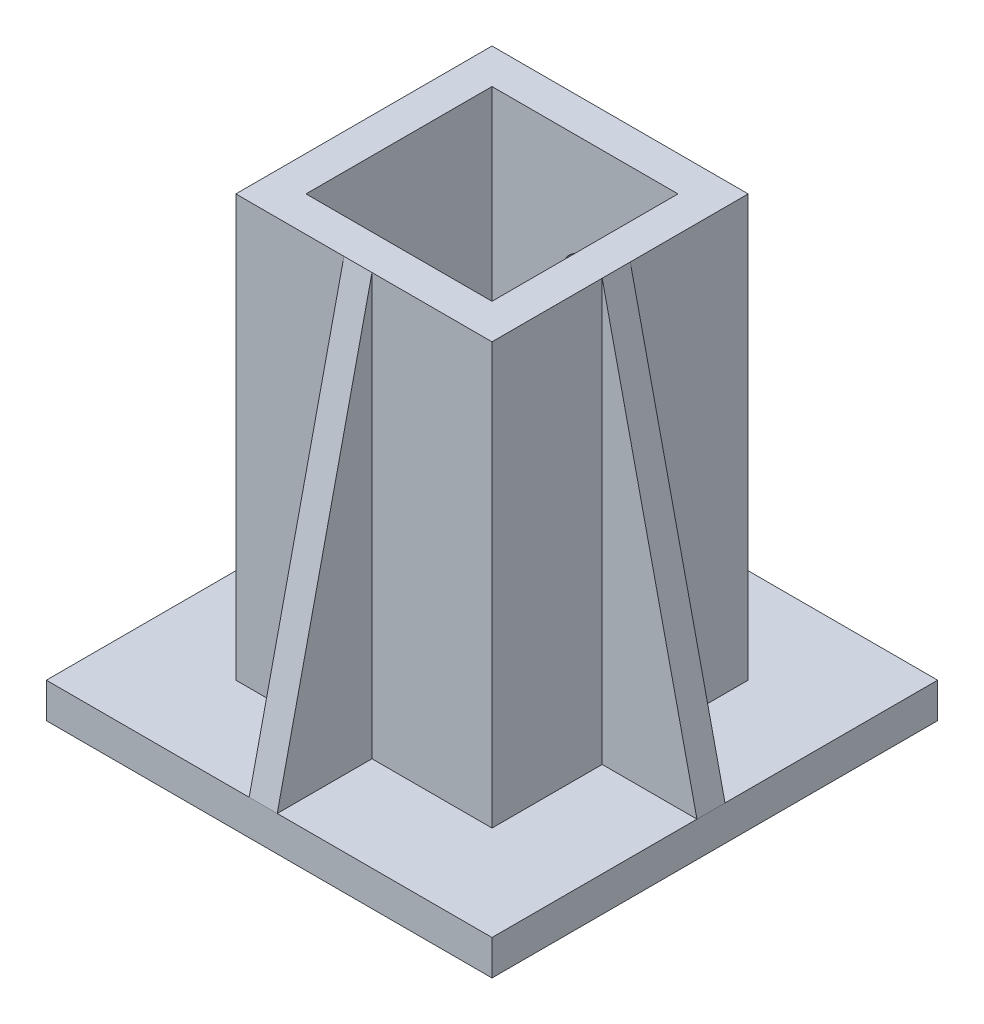
ISO-10303-21;
HEADER;
FILE_DESCRIPTION(('STEP AP214'),'2;1');
FILE_NAME('part.step','',(''),(''),'','','');
FILE_SCHEMA(('AUTOMOTIVE_DESIGN { 1 0 10303 214 1 1 1 1 }'));
ENDSEC;
DATA;
#1=APPLICATION_CONTEXT('core data for automotive mechanical design processes');
#2=APPLICATION_PROTOCOL_DEFINITION('international standard','automotive_design',2000,#1);
#3=PRODUCT_CONTEXT('',#1,'mechanical');
#4=PRODUCT('Part','Part','',(#3));
#5=PRODUCT_RELATED_PRODUCT_CATEGORY('part','',(#4));
#6=PRODUCT_DEFINITION_FORMATION('','',#4);
#7=PRODUCT_DEFINITION_CONTEXT('part definition',#1,'design');
#8=PRODUCT_DEFINITION('design','',#6,#7);
#9=PRODUCT_DEFINITION_SHAPE('','',#8);
#10=(LENGTH_UNIT() NAMED_UNIT(*) SI_UNIT(.MILLI.,.METRE.));
#11=(NAMED_UNIT(*) PLANE_ANGLE_UNIT() SI_UNIT($,.RADIAN.));
#12=(NAMED_UNIT(*) SI_UNIT($,.STERADIAN.) SOLID_ANGLE_UNIT());
#13=UNCERTAINTY_MEASURE_WITH_UNIT(LENGTH_MEASURE(1.E-05),#10,'distance_accuracy_value','');
#14=(GEOMETRIC_REPRESENTATION_CONTEXT(3) GLOBAL_UNCERTAINTY_ASSIGNED_CONTEXT((#13)) GLOBAL_UNIT_ASSIGNED_CONTEXT((#10,
#11,#12)) REPRESENTATION_CONTEXT('',''));
#15=CARTESIAN_POINT('',(0.,0.,0.));
#16=DIRECTION('',(0.,0.,1.));
#17=DIRECTION('',(1.,0.,0.));
#18=AXIS2_PLACEMENT_3D('',#15,#16,#17);
#19=CARTESIAN_POINT('',(0.,5.,0.));
#20=DIRECTION('',(0.,-1.,0.));
#21=DIRECTION('',(0.,0.,-1.));
#22=AXIS2_PLACEMENT_3D('',#19,#20,#21);
#23=PLANE('',#22);
#24=DIRECTION('',(0.,0.,1.));
#25=VECTOR('',#24,1.);
#26=CARTESIAN_POINT('',(-2.85000000000001,5.,18.25));
#27=LINE('',#26,#25);
#28=CARTESIAN_POINT('',(-2.85000000000001,5.,18.25));
#29=VERTEX_POINT('',#28);
#30=CARTESIAN_POINT('',(-2.85000000000005,5.,31.75));
#31=VERTEX_POINT('',#30);
#32=EDGE_CURVE('E195',#29,#31,#27,.T.);
#33=ORIENTED_EDGE('',*,*,#32,.F.);
#34=DIRECTION('',(1.,0.,0.));
#35=VECTOR('',#34,1.);
#36=CARTESIAN_POINT('',(18.25,5.,18.25));
#37=LINE('',#36,#35);
#38=CARTESIAN_POINT('',(-18.25,5.,18.25));
#39=VERTEX_POINT('',#38);
#40=EDGE_CURVE('E205',#39,#29,#37,.T.);
#41=ORIENTED_EDGE('',*,*,#40,.F.);
#42=DIRECTION('',(0.,0.,1.));
#43=VECTOR('',#42,1.);
#44=CARTESIAN_POINT('',(-18.25,5.,18.25));
#45=LINE('',#44,#43);
#46=CARTESIAN_POINT('',(-18.25,5.,2.55));
#47=VERTEX_POINT('',#46);
#48=EDGE_CURVE('E230',#47,#39,#45,.T.);
#49=ORIENTED_EDGE('',*,*,#48,.F.);
#50=DIRECTION('',(1.,0.,0.));
#51=VECTOR('',#50,1.);
#52=CARTESIAN_POINT('',(-31.75,5.,2.55));
#53=LINE('',#52,#51);
#54=CARTESIAN_POINT('',(-31.75,5.,2.55));
#55=VERTEX_POINT('',#54);
#56=EDGE_CURVE('E323',#55,#47,#53,.T.);
#57=ORIENTED_EDGE('',*,*,#56,.F.);
#58=DIRECTION('',(0.,0.,1.));
#59=VECTOR('',#58,1.);
#60=CARTESIAN_POINT('',(-31.75,5.,-31.75));
#61=LINE('',#60,#59);
#62=CARTESIAN_POINT('',(-31.75,5.,31.75));
#63=VERTEX_POINT('',#62);
#64=EDGE_CURVE('E248',#55,#63,#61,.T.);
#65=ORIENTED_EDGE('',*,*,#64,.T.);
#66=DIRECTION('',(1.,0.,0.));
#67=VECTOR('',#66,1.);
#68=CARTESIAN_POINT('',(31.75,5.,31.75));
#69=LINE('',#68,#67);
#70=EDGE_CURVE('E249',#63,#31,#69,.T.);
#71=ORIENTED_EDGE('',*,*,#70,.T.);
#72=EDGE_LOOP('',(#33,#41,#49,#57,#65,#71));
#73=FACE_BOUND('',#72,.T.);
#74=ADVANCED_FACE('F33',(#73),#23,.F.);
#75=DIRECTION('',(0.,0.,-1.));
#76=VECTOR('',#75,1.);
#77=CARTESIAN_POINT('',(1.14999999999999,5.,18.25));
#78=LINE('',#77,#76);
#79=CARTESIAN_POINT('',(1.15,5.,31.75));
#80=VERTEX_POINT('',#79);
#81=CARTESIAN_POINT('',(1.14999999999999,5.,18.25));
#82=VERTEX_POINT('',#81);
#83=EDGE_CURVE('E207',#80,#82,#78,.T.);
#84=ORIENTED_EDGE('',*,*,#83,.F.);
#85=CARTESIAN_POINT('',(31.75,5.,31.75));
#86=VERTEX_POINT('',#85);
#87=EDGE_CURVE('E247',#80,#86,#69,.T.);
#88=ORIENTED_EDGE('',*,*,#87,.T.);
#89=DIRECTION('',(0.,0.,-1.));
#90=VECTOR('',#89,1.);
#91=CARTESIAN_POINT('',(31.75,5.,-31.75));
#92=LINE('',#91,#90);
#93=CARTESIAN_POINT('',(31.75,5.,2.55000000000005));
#94=VERTEX_POINT('',#93);
#95=EDGE_CURVE('E252',#86,#94,#92,.T.);
#96=ORIENTED_EDGE('',*,*,#95,.T.);
#97=DIRECTION('',(1.,0.,0.));
#98=VECTOR('',#97,1.);
#99=CARTESIAN_POINT('',(18.25,5.,2.55));
#100=LINE('',#99,#98);
#101=CARTESIAN_POINT('',(18.25,5.,2.55));
#102=VERTEX_POINT('',#101);
#103=EDGE_CURVE('E307',#102,#94,#100,.T.);
#104=ORIENTED_EDGE('',*,*,#103,.F.);
#105=DIRECTION('',(0.,0.,-1.));
#106=VECTOR('',#105,1.);
#107=CARTESIAN_POINT('',(18.25,5.,18.25));
#108=LINE('',#107,#106);
#109=CARTESIAN_POINT('',(18.25,5.,18.25));
#110=VERTEX_POINT('',#109);
#111=EDGE_CURVE('E224',#110,#102,#108,.T.);
#112=ORIENTED_EDGE('',*,*,#111,.F.);
#113=EDGE_CURVE('E234',#82,#110,#37,.T.);
#114=ORIENTED_EDGE('',*,*,#113,.F.);
#115=EDGE_LOOP('',(#84,#88,#96,#104,#112,#114));
#116=FACE_BOUND('',#115,.T.);
#117=ADVANCED_FACE('F404',(#116),#23,.F.);
#118=CARTESIAN_POINT('',(18.25,65.,18.25));
#119=DIRECTION('',(0.,0.,-1.));
#120=DIRECTION('',(-1.,0.,0.));
#121=AXIS2_PLACEMENT_3D('',#118,#119,#120);
#122=PLANE('',#121);
#123=DIRECTION('',(0.,-1.,0.));
#124=VECTOR('',#123,1.);
#125=CARTESIAN_POINT('',(-2.85000000000001,65.,18.25));
#126=LINE('',#125,#124);
#127=CARTESIAN_POINT('',(-2.85000000000005,65.,18.25));
#128=VERTEX_POINT('',#127);
#129=EDGE_CURVE('E193',#128,#29,#126,.T.);
#130=ORIENTED_EDGE('',*,*,#129,.F.);
#131=DIRECTION('',(1.,0.,0.));
#132=VECTOR('',#131,1.);
#133=CARTESIAN_POINT('',(18.25,65.,18.25));
#134=LINE('',#133,#132);
#135=CARTESIAN_POINT('',(-18.25,65.,18.25));
#136=VERTEX_POINT('',#135);
#137=EDGE_CURVE('E203',#136,#128,#134,.T.);
#138=ORIENTED_EDGE('',*,*,#137,.F.);
#139=DIRECTION('',(0.,-1.,0.));
#140=VECTOR('',#139,1.);
#141=CARTESIAN_POINT('',(-18.25,65.,18.25));
#142=LINE('',#141,#140);
#143=EDGE_CURVE('E218',#136,#39,#142,.T.);
#144=ORIENTED_EDGE('',*,*,#143,.T.);
#145=ORIENTED_EDGE('',*,*,#40,.T.);
#146=EDGE_LOOP('',(#130,#138,#144,#145));
#147=FACE_BOUND('',#146,.T.);
#148=ADVANCED_FACE('F201',(#147),#122,.F.);
#149=DIRECTION('',(0.,-1.,0.));
#150=VECTOR('',#149,1.);
#151=CARTESIAN_POINT('',(1.14999999999999,65.,18.25));
#152=LINE('',#151,#150);
#153=CARTESIAN_POINT('',(1.14999999999993,65.,18.25));
#154=VERTEX_POINT('',#153);
#155=EDGE_CURVE('E206',#154,#82,#152,.T.);
#156=ORIENTED_EDGE('',*,*,#155,.T.);
#157=ORIENTED_EDGE('',*,*,#113,.T.);
#158=DIRECTION('',(0.,-1.,0.));
#159=VECTOR('',#158,1.);
#160=CARTESIAN_POINT('',(18.25,65.,18.25));
#161=LINE('',#160,#159);
#162=CARTESIAN_POINT('',(18.25,65.,18.25));
#163=VERTEX_POINT('',#162);
#164=EDGE_CURVE('E214',#163,#110,#161,.T.);
#165=ORIENTED_EDGE('',*,*,#164,.F.);
#166=EDGE_CURVE('E215',#154,#163,#134,.T.);
#167=ORIENTED_EDGE('',*,*,#166,.F.);
#168=EDGE_LOOP('',(#156,#157,#165,#167));
#169=FACE_BOUND('',#168,.T.);
#170=ADVANCED_FACE('F428',(#169),#122,.F.);
#171=DIRECTION('',(-1.,0.,0.));
#172=VECTOR('',#171,1.);
#173=CARTESIAN_POINT('',(18.25,5.,-1.45));
#174=LINE('',#173,#172);
#175=CARTESIAN_POINT('',(31.75,5.,-1.45));
#176=VERTEX_POINT('',#175);
#177=CARTESIAN_POINT('',(18.25,5.,-1.45));
#178=VERTEX_POINT('',#177);
#179=EDGE_CURVE('E310',#176,#178,#174,.T.);
#180=ORIENTED_EDGE('',*,*,#179,.F.);
#181=CARTESIAN_POINT('',(31.75,5.,-31.75));
#182=VERTEX_POINT('',#181);
#183=EDGE_CURVE('E251',#176,#182,#92,.T.);
#184=ORIENTED_EDGE('',*,*,#183,.T.);
#185=DIRECTION('',(-1.,0.,0.));
#186=VECTOR('',#185,1.);
#187=CARTESIAN_POINT('',(31.75,5.,-31.75));
#188=LINE('',#187,#186);
#189=CARTESIAN_POINT('',(-31.75,5.,-31.75));
#190=VERTEX_POINT('',#189);
#191=EDGE_CURVE('E255',#182,#190,#188,.T.);
#192=ORIENTED_EDGE('',*,*,#191,.T.);
#193=CARTESIAN_POINT('',(-31.75,5.,-1.44999999999995));
#194=VERTEX_POINT('',#193);
#195=EDGE_CURVE('E245',#190,#194,#61,.T.);
#196=ORIENTED_EDGE('',*,*,#195,.T.);
#197=DIRECTION('',(-1.,0.,0.));
#198=VECTOR('',#197,1.);
#199=CARTESIAN_POINT('',(-31.75,5.,-1.45));
#200=LINE('',#199,#198);
#201=CARTESIAN_POINT('',(-18.25,5.,-1.45));
#202=VERTEX_POINT('',#201);
#203=EDGE_CURVE('E325',#202,#194,#200,.T.);
#204=ORIENTED_EDGE('',*,*,#203,.F.);
#205=CARTESIAN_POINT('',(-18.25,5.,-18.25));
#206=VERTEX_POINT('',#205);
#207=EDGE_CURVE('E231',#206,#202,#45,.T.);
#208=ORIENTED_EDGE('',*,*,#207,.F.);
#209=DIRECTION('',(-1.,0.,0.));
#210=VECTOR('',#209,1.);
#211=CARTESIAN_POINT('',(18.25,5.,-18.25));
#212=LINE('',#211,#210);
#213=CARTESIAN_POINT('',(18.25,5.,-18.25));
#214=VERTEX_POINT('',#213);
#215=EDGE_CURVE('E227',#214,#206,#212,.T.);
#216=ORIENTED_EDGE('',*,*,#215,.F.);
#217=EDGE_CURVE('E58',#178,#214,#108,.T.);
#218=ORIENTED_EDGE('',*,*,#217,.F.);
#219=EDGE_LOOP('',(#180,#184,#192,#196,#204,#208,#216,#218));
#220=FACE_BOUND('',#219,.T.);
#221=ADVANCED_FACE('F411',(#220),#23,.F.);
#222=CARTESIAN_POINT('',(18.25,65.,18.25));
#223=DIRECTION('',(-1.,0.,0.));
#224=DIRECTION('',(0.,0.,1.));
#225=AXIS2_PLACEMENT_3D('',#222,#223,#224);
#226=PLANE('',#225);
#227=DIRECTION('',(0.,-1.,0.));
#228=VECTOR('',#227,1.);
#229=CARTESIAN_POINT('',(18.25,65.,2.55));
#230=LINE('',#229,#228);
#231=CARTESIAN_POINT('',(18.25,65.,2.55000000000005));
#232=VERTEX_POINT('',#231);
#233=EDGE_CURVE('E314',#232,#102,#230,.T.);
#234=ORIENTED_EDGE('',*,*,#233,.F.);
#235=DIRECTION('',(0.,0.,-1.));
#236=VECTOR('',#235,1.);
#237=CARTESIAN_POINT('',(18.25,65.,18.25));
#238=LINE('',#237,#236);
#239=EDGE_CURVE('E363',#163,#232,#238,.T.);
#240=ORIENTED_EDGE('',*,*,#239,.F.);
#241=ORIENTED_EDGE('',*,*,#164,.T.);
#242=ORIENTED_EDGE('',*,*,#111,.T.);
#243=EDGE_LOOP('',(#234,#240,#241,#242));
#244=FACE_BOUND('',#243,.T.);
#245=ADVANCED_FACE('F427',(#244),#226,.F.);
#246=DIRECTION('',(0.,-1.,0.));
#247=VECTOR('',#246,1.);
#248=CARTESIAN_POINT('',(18.25,65.,-1.45));
#249=LINE('',#248,#247);
#250=CARTESIAN_POINT('',(18.25,65.,-1.44999999999995));
#251=VERTEX_POINT('',#250);
#252=EDGE_CURVE('E312',#251,#178,#249,.T.);
#253=ORIENTED_EDGE('',*,*,#252,.T.);
#254=ORIENTED_EDGE('',*,*,#217,.T.);
#255=DIRECTION('',(0.,-1.,0.));
#256=VECTOR('',#255,1.);
#257=CARTESIAN_POINT('',(18.25,65.,-18.25));
#258=LINE('',#257,#256);
#259=CARTESIAN_POINT('',(18.25,65.,-18.25));
#260=VERTEX_POINT('',#259);
#261=EDGE_CURVE('E241',#260,#214,#258,.T.);
#262=ORIENTED_EDGE('',*,*,#261,.F.);
#263=EDGE_CURVE('E235',#251,#260,#238,.T.);
#264=ORIENTED_EDGE('',*,*,#263,.F.);
#265=EDGE_LOOP('',(#253,#254,#262,#264));
#266=FACE_BOUND('',#265,.T.);
#267=ADVANCED_FACE('F434',(#266),#226,.F.);
#268=CARTESIAN_POINT('',(-31.75,5.,-31.75));
#269=DIRECTION('',(1.,0.,0.));
#270=DIRECTION('',(0.,0.,-1.));
#271=AXIS2_PLACEMENT_3D('',#268,#269,#270);
#272=PLANE('',#271);
#273=DIRECTION('',(0.,0.,-1.));
#274=VECTOR('',#273,1.);
#275=CARTESIAN_POINT('',(-31.75,5.,141.122521626764));
#276=LINE('',#275,#274);
#277=EDGE_CURVE('E316',#55,#194,#276,.T.);
#278=ORIENTED_EDGE('',*,*,#277,.T.);
#279=ORIENTED_EDGE('',*,*,#195,.F.);
#280=DIRECTION('',(0.,-1.,0.));
#281=VECTOR('',#280,1.);
#282=CARTESIAN_POINT('',(-31.75,5.,-31.75));
#283=LINE('',#282,#281);
#284=CARTESIAN_POINT('',(-31.75,0.,-31.75));
#285=VERTEX_POINT('',#284);
#286=EDGE_CURVE('E257',#190,#285,#283,.T.);
#287=ORIENTED_EDGE('',*,*,#286,.T.);
#288=DIRECTION('',(0.,0.,1.));
#289=VECTOR('',#288,1.);
#290=CARTESIAN_POINT('',(-31.75,0.,-31.75));
#291=LINE('',#290,#289);
#292=CARTESIAN_POINT('',(-31.75,0.,31.75));
#293=VERTEX_POINT('',#292);
#294=EDGE_CURVE('E244',#285,#293,#291,.T.);
#295=ORIENTED_EDGE('',*,*,#294,.T.);
#296=DIRECTION('',(0.,-1.,0.));
#297=VECTOR('',#296,1.);
#298=CARTESIAN_POINT('',(-31.75,5.,31.75));
#299=LINE('',#298,#297);
#300=EDGE_CURVE('E274',#63,#293,#299,.T.);
#301=ORIENTED_EDGE('',*,*,#300,.F.);
#302=ORIENTED_EDGE('',*,*,#64,.F.);
#303=EDGE_LOOP('',(#278,#279,#287,#295,#301,#302));
#304=FACE_BOUND('',#303,.T.);
#305=ADVANCED_FACE('F35',(#304),#272,.F.);
#306=CARTESIAN_POINT('',(0.,65.,0.));
#307=DIRECTION('',(0.,1.,0.));
#308=DIRECTION('',(0.,0.,1.));
#309=AXIS2_PLACEMENT_3D('',#306,#307,#308);
#310=PLANE('',#309);
#311=DIRECTION('',(1.,0.,0.));
#312=VECTOR('',#311,1.);
#313=CARTESIAN_POINT('',(-141.422521626764,65.,18.25));
#314=LINE('',#313,#312);
#315=EDGE_CURVE('E180',#128,#154,#314,.T.);
#316=ORIENTED_EDGE('',*,*,#315,.T.);
#317=ORIENTED_EDGE('',*,*,#166,.T.);
#318=ORIENTED_EDGE('',*,*,#239,.T.);
#319=DIRECTION('',(0.,0.,-1.));
#320=VECTOR('',#319,1.);
#321=CARTESIAN_POINT('',(18.25,65.,141.122521626764));
#322=LINE('',#321,#320);
#323=EDGE_CURVE('E300',#232,#251,#322,.T.);
#324=ORIENTED_EDGE('',*,*,#323,.T.);
#325=ORIENTED_EDGE('',*,*,#263,.T.);
#326=DIRECTION('',(-1.,0.,0.));
#327=VECTOR('',#326,1.);
#328=CARTESIAN_POINT('',(18.25,65.,-18.25));
#329=LINE('',#328,#327);
#330=CARTESIAN_POINT('',(-18.25,65.,-18.25));
#331=VERTEX_POINT('',#330);
#332=EDGE_CURVE('E365',#260,#331,#329,.T.);
#333=ORIENTED_EDGE('',*,*,#332,.T.);
#334=DIRECTION('',(0.,0.,1.));
#335=VECTOR('',#334,1.);
#336=CARTESIAN_POINT('',(-18.25,65.,18.25));
#337=LINE('',#336,#335);
#338=CARTESIAN_POINT('',(-18.25,65.,-1.45));
#339=VERTEX_POINT('',#338);
#340=EDGE_CURVE('E220',#331,#339,#337,.T.);
#341=ORIENTED_EDGE('',*,*,#340,.T.);
#342=DIRECTION('',(0.,0.,-1.));
#343=VECTOR('',#342,1.);
#344=CARTESIAN_POINT('',(-18.25,65.,141.122521626764));
#345=LINE('',#344,#343);
#346=CARTESIAN_POINT('',(-18.25,65.,2.55));
#347=VERTEX_POINT('',#346);
#348=EDGE_CURVE('E50',#347,#339,#345,.T.);
#349=ORIENTED_EDGE('',*,*,#348,.F.);
#350=EDGE_CURVE('E212',#347,#136,#337,.T.);
#351=ORIENTED_EDGE('',*,*,#350,.T.);
#352=ORIENTED_EDGE('',*,*,#137,.T.);
#353=EDGE_LOOP('',(#316,#317,#318,#324,#325,#333,#341,#349,#351,#352));
#354=FACE_BOUND('',#353,.T.);
#355=DIRECTION('',(1.,0.,0.));
#356=VECTOR('',#355,1.);
#357=CARTESIAN_POINT('',(13.25,65.,13.25));
#358=LINE('',#357,#356);
#359=CARTESIAN_POINT('',(-13.25,65.,13.25));
#360=VERTEX_POINT('',#359);
#361=CARTESIAN_POINT('',(13.25,65.,13.25));
#362=VERTEX_POINT('',#361);
#363=EDGE_CURVE('E336',#360,#362,#358,.T.);
#364=ORIENTED_EDGE('',*,*,#363,.F.);
#365=DIRECTION('',(0.,0.,1.));
#366=VECTOR('',#365,1.);
#367=CARTESIAN_POINT('',(-13.25,65.,13.25));
#368=LINE('',#367,#366);
#369=CARTESIAN_POINT('',(-13.25,65.,-13.25));
#370=VERTEX_POINT('',#369);
#371=EDGE_CURVE('E334',#370,#360,#368,.T.);
#372=ORIENTED_EDGE('',*,*,#371,.F.);
#373=DIRECTION('',(-1.,0.,0.));
#374=VECTOR('',#373,1.);
#375=CARTESIAN_POINT('',(13.25,65.,-13.25));
#376=LINE('',#375,#374);
#377=CARTESIAN_POINT('',(13.25,65.,-13.25));
#378=VERTEX_POINT('',#377);
#379=EDGE_CURVE('E342',#378,#370,#376,.T.);
#380=ORIENTED_EDGE('',*,*,#379,.F.);
#381=DIRECTION('',(0.,0.,-1.));
#382=VECTOR('',#381,1.);
#383=CARTESIAN_POINT('',(13.25,65.,13.25));
#384=LINE('',#383,#382);
#385=EDGE_CURVE('E339',#362,#378,#384,.T.);
#386=ORIENTED_EDGE('',*,*,#385,.F.);
#387=EDGE_LOOP('',(#364,#372,#380,#386));
#388=FACE_BOUND('',#387,.T.);
#389=ADVANCED_FACE('F209',(#354,#388),#310,.T.);
#390=CARTESIAN_POINT('',(-31.75,65.,2.55));
#391=DIRECTION('',(0.,0.,-1.));
#392=DIRECTION('',(-1.,0.,0.));
#393=AXIS2_PLACEMENT_3D('',#390,#391,#392);
#394=PLANE('',#393);
#395=DIRECTION('',(0.219512195121951,0.975609756097561,0.));
#396=VECTOR('',#395,1.);
#397=CARTESIAN_POINT('',(-18.900505651398,62.1088637715646,2.55));
#398=LINE('',#397,#396);
#399=EDGE_CURVE('E318',#55,#347,#398,.T.);
#400=ORIENTED_EDGE('',*,*,#399,.F.);
#401=ORIENTED_EDGE('',*,*,#56,.T.);
#402=DIRECTION('',(0.,-1.,0.));
#403=VECTOR('',#402,1.);
#404=CARTESIAN_POINT('',(-18.25,65.,2.55));
#405=LINE('',#404,#403);
#406=EDGE_CURVE('E330',#347,#47,#405,.T.);
#407=ORIENTED_EDGE('',*,*,#406,.F.);
#408=EDGE_LOOP('',(#400,#401,#407));
#409=FACE_BOUND('',#408,.T.);
#410=ADVANCED_FACE('F376',(#409),#394,.F.);
#411=CARTESIAN_POINT('',(-31.75,65.,-1.45));
#412=DIRECTION('',(0.,0.,1.));
#413=DIRECTION('',(1.,0.,0.));
#414=AXIS2_PLACEMENT_3D('',#411,#412,#413);
#415=PLANE('',#414);
#416=DIRECTION('',(-0.219512195121951,-0.975609756097561,0.));
#417=VECTOR('',#416,1.);
#418=CARTESIAN_POINT('',(-18.900505651398,62.1088637715646,-1.45));
#419=LINE('',#418,#417);
#420=EDGE_CURVE('E277',#339,#194,#419,.T.);
#421=ORIENTED_EDGE('',*,*,#420,.F.);
#422=DIRECTION('',(0.,-1.,0.));
#423=VECTOR('',#422,1.);
#424=CARTESIAN_POINT('',(-18.25,65.,-1.45));
#425=LINE('',#424,#423);
#426=EDGE_CURVE('E328',#339,#202,#425,.T.);
#427=ORIENTED_EDGE('',*,*,#426,.T.);
#428=ORIENTED_EDGE('',*,*,#203,.T.);
#429=EDGE_LOOP('',(#421,#427,#428));
#430=FACE_BOUND('',#429,.T.);
#431=ADVANCED_FACE('F393',(#430),#415,.F.);
#432=CARTESIAN_POINT('',(-18.25,65.,18.25));
#433=DIRECTION('',(1.,0.,0.));
#434=DIRECTION('',(0.,0.,-1.));
#435=AXIS2_PLACEMENT_3D('',#432,#433,#434);
#436=PLANE('',#435);
#437=ORIENTED_EDGE('',*,*,#406,.T.);
#438=ORIENTED_EDGE('',*,*,#48,.T.);
#439=ORIENTED_EDGE('',*,*,#143,.F.);
#440=ORIENTED_EDGE('',*,*,#350,.F.);
#441=EDGE_LOOP('',(#437,#438,#439,#440));
#442=FACE_BOUND('',#441,.T.);
#443=ADVANCED_FACE('F390',(#442),#436,.F.);
#444=ORIENTED_EDGE('',*,*,#426,.F.);
#445=ORIENTED_EDGE('',*,*,#340,.F.);
#446=DIRECTION('',(0.,-1.,0.));
#447=VECTOR('',#446,1.);
#448=CARTESIAN_POINT('',(-18.25,65.,-18.25));
#449=LINE('',#448,#447);
#450=EDGE_CURVE('E238',#331,#206,#449,.T.);
#451=ORIENTED_EDGE('',*,*,#450,.T.);
#452=ORIENTED_EDGE('',*,*,#207,.T.);
#453=EDGE_LOOP('',(#444,#445,#451,#452));
#454=FACE_BOUND('',#453,.T.);
#455=ADVANCED_FACE('F392',(#454),#436,.F.);
#456=CARTESIAN_POINT('',(31.75,5.,31.75));
#457=DIRECTION('',(0.,0.,-1.));
#458=DIRECTION('',(-1.,0.,0.));
#459=AXIS2_PLACEMENT_3D('',#456,#457,#458);
#460=PLANE('',#459);
#461=ORIENTED_EDGE('',*,*,#87,.F.);
#462=DIRECTION('',(1.,0.,0.));
#463=VECTOR('',#462,1.);
#464=CARTESIAN_POINT('',(-141.422521626764,5.,31.75));
#465=LINE('',#464,#463);
#466=EDGE_CURVE('E187',#31,#80,#465,.T.);
#467=ORIENTED_EDGE('',*,*,#466,.F.);
#468=ORIENTED_EDGE('',*,*,#70,.F.);
#469=ORIENTED_EDGE('',*,*,#300,.T.);
#470=DIRECTION('',(1.,0.,0.));
#471=VECTOR('',#470,1.);
#472=CARTESIAN_POINT('',(31.75,0.,31.75));
#473=LINE('',#472,#471);
#474=CARTESIAN_POINT('',(31.75,0.,31.75));
#475=VERTEX_POINT('',#474);
#476=EDGE_CURVE('E260',#293,#475,#473,.T.);
#477=ORIENTED_EDGE('',*,*,#476,.T.);
#478=DIRECTION('',(0.,-1.,0.));
#479=VECTOR('',#478,1.);
#480=CARTESIAN_POINT('',(31.75,5.,31.75));
#481=LINE('',#480,#479);
#482=EDGE_CURVE('E271',#86,#475,#481,.T.);
#483=ORIENTED_EDGE('',*,*,#482,.F.);
#484=EDGE_LOOP('',(#461,#467,#468,#469,#477,#483));
#485=FACE_BOUND('',#484,.T.);
#486=ADVANCED_FACE('F387',(#485),#460,.F.);
#487=CARTESIAN_POINT('',(31.75,5.,-31.75));
#488=DIRECTION('',(-1.,0.,0.));
#489=DIRECTION('',(0.,0.,1.));
#490=AXIS2_PLACEMENT_3D('',#487,#488,#489);
#491=PLANE('',#490);
#492=ORIENTED_EDGE('',*,*,#183,.F.);
#493=DIRECTION('',(0.,0.,-1.));
#494=VECTOR('',#493,1.);
#495=CARTESIAN_POINT('',(31.75,5.,141.122521626764));
#496=LINE('',#495,#494);
#497=EDGE_CURVE('E299',#94,#176,#496,.T.);
#498=ORIENTED_EDGE('',*,*,#497,.F.);
#499=ORIENTED_EDGE('',*,*,#95,.F.);
#500=ORIENTED_EDGE('',*,*,#482,.T.);
#501=DIRECTION('',(0.,0.,-1.));
#502=VECTOR('',#501,1.);
#503=CARTESIAN_POINT('',(31.75,0.,-31.75));
#504=LINE('',#503,#502);
#505=CARTESIAN_POINT('',(31.75,0.,-31.75));
#506=VERTEX_POINT('',#505);
#507=EDGE_CURVE('E262',#475,#506,#504,.T.);
#508=ORIENTED_EDGE('',*,*,#507,.T.);
#509=DIRECTION('',(0.,-1.,0.));
#510=VECTOR('',#509,1.);
#511=CARTESIAN_POINT('',(31.75,5.,-31.75));
#512=LINE('',#511,#510);
#513=EDGE_CURVE('E268',#182,#506,#512,.T.);
#514=ORIENTED_EDGE('',*,*,#513,.F.);
#515=EDGE_LOOP('',(#492,#498,#499,#500,#508,#514));
#516=FACE_BOUND('',#515,.T.);
#517=ADVANCED_FACE('F444',(#516),#491,.F.);
#518=CARTESIAN_POINT('',(31.75,5.,-31.75));
#519=DIRECTION('',(0.,0.,1.));
#520=DIRECTION('',(1.,0.,0.));
#521=AXIS2_PLACEMENT_3D('',#518,#519,#520);
#522=PLANE('',#521);
#523=DIRECTION('',(-1.,0.,0.));
#524=VECTOR('',#523,1.);
#525=CARTESIAN_POINT('',(31.75,0.,-31.75));
#526=LINE('',#525,#524);
#527=EDGE_CURVE('E264',#506,#285,#526,.T.);
#528=ORIENTED_EDGE('',*,*,#527,.T.);
#529=ORIENTED_EDGE('',*,*,#286,.F.);
#530=ORIENTED_EDGE('',*,*,#191,.F.);
#531=ORIENTED_EDGE('',*,*,#513,.T.);
#532=EDGE_LOOP('',(#528,#529,#530,#531));
#533=FACE_BOUND('',#532,.T.);
#534=ADVANCED_FACE('F451',(#533),#522,.F.);
#535=CARTESIAN_POINT('',(0.,0.,0.));
#536=DIRECTION('',(0.,-1.,0.));
#537=DIRECTION('',(0.,0.,-1.));
#538=AXIS2_PLACEMENT_3D('',#535,#536,#537);
#539=PLANE('',#538);
#540=ORIENTED_EDGE('',*,*,#294,.F.);
#541=ORIENTED_EDGE('',*,*,#527,.F.);
#542=ORIENTED_EDGE('',*,*,#507,.F.);
#543=ORIENTED_EDGE('',*,*,#476,.F.);
#544=EDGE_LOOP('',(#540,#541,#542,#543));
#545=FACE_BOUND('',#544,.T.);
#546=ADVANCED_FACE('F468',(#545),#539,.T.);
#547=CARTESIAN_POINT('',(18.25,65.,-18.25));
#548=DIRECTION('',(0.,0.,1.));
#549=DIRECTION('',(1.,0.,0.));
#550=AXIS2_PLACEMENT_3D('',#547,#548,#549);
#551=PLANE('',#550);
#552=CARTESIAN_POINT('',(0.,47.4664440189098,-18.25));
#553=DIRECTION('',(0.,0.,-1.));
#554=DIRECTION('',(-1.,0.,0.));
#555=AXIS2_PLACEMENT_3D('',#552,#553,#554);
#556=CIRCLE('',#555,3.175);
#557=CARTESIAN_POINT('',(-3.175,47.4664440189098,-18.25));
#558=VERTEX_POINT('',#557);
#559=EDGE_CURVE('E292',#558,#558,#556,.T.);
#560=ORIENTED_EDGE('',*,*,#559,.F.);
#561=EDGE_LOOP('',(#560));
#562=FACE_BOUND('',#561,.T.);
#563=CARTESIAN_POINT('',(0.,17.7393658676567,-18.25));
#564=DIRECTION('',(0.,0.,-1.));
#565=DIRECTION('',(-1.,0.,0.));
#566=AXIS2_PLACEMENT_3D('',#563,#564,#565);
#567=CIRCLE('',#566,3.175);
#568=CARTESIAN_POINT('',(-3.175,17.7393658676567,-18.25));
#569=VERTEX_POINT('',#568);
#570=EDGE_CURVE('E283',#569,#569,#567,.T.);
#571=ORIENTED_EDGE('',*,*,#570,.F.);
#572=EDGE_LOOP('',(#571));
#573=FACE_BOUND('',#572,.T.);
#574=ORIENTED_EDGE('',*,*,#215,.T.);
#575=ORIENTED_EDGE('',*,*,#450,.F.);
#576=ORIENTED_EDGE('',*,*,#332,.F.);
#577=ORIENTED_EDGE('',*,*,#261,.T.);
#578=EDGE_LOOP('',(#574,#575,#576,#577));
#579=FACE_BOUND('',#578,.T.);
#580=ADVANCED_FACE('F454',(#562,#573,#579),#551,.F.);
#581=CARTESIAN_POINT('',(-13.25,65.,13.25));
#582=DIRECTION('',(1.,0.,0.));
#583=DIRECTION('',(0.,0.,-1.));
#584=AXIS2_PLACEMENT_3D('',#581,#582,#583);
#585=PLANE('',#584);
#586=DIRECTION('',(0.,0.,1.));
#587=VECTOR('',#586,1.);
#588=CARTESIAN_POINT('',(-13.25,5.,13.25));
#589=LINE('',#588,#587);
#590=CARTESIAN_POINT('',(-13.25,5.,-13.25));
#591=VERTEX_POINT('',#590);
#592=CARTESIAN_POINT('',(-13.25,5.,13.25));
#593=VERTEX_POINT('',#592);
#594=EDGE_CURVE('E333',#591,#593,#589,.T.);
#595=ORIENTED_EDGE('',*,*,#594,.F.);
#596=DIRECTION('',(0.,-1.,0.));
#597=VECTOR('',#596,1.);
#598=CARTESIAN_POINT('',(-13.25,65.,-13.25));
#599=LINE('',#598,#597);
#600=EDGE_CURVE('E344',#370,#591,#599,.T.);
#601=ORIENTED_EDGE('',*,*,#600,.F.);
#602=ORIENTED_EDGE('',*,*,#371,.T.);
#603=DIRECTION('',(0.,-1.,0.));
#604=VECTOR('',#603,1.);
#605=CARTESIAN_POINT('',(-13.25,65.,13.25));
#606=LINE('',#605,#604);
#607=EDGE_CURVE('E360',#360,#593,#606,.T.);
#608=ORIENTED_EDGE('',*,*,#607,.T.);
#609=EDGE_LOOP('',(#595,#601,#602,#608));
#610=FACE_BOUND('',#609,.T.);
#611=ADVANCED_FACE('F474',(#610),#585,.T.);
#612=CARTESIAN_POINT('',(13.25,65.,13.25));
#613=DIRECTION('',(0.,0.,-1.));
#614=DIRECTION('',(-1.,0.,0.));
#615=AXIS2_PLACEMENT_3D('',#612,#613,#614);
#616=PLANE('',#615);
#617=DIRECTION('',(1.,0.,0.));
#618=VECTOR('',#617,1.);
#619=CARTESIAN_POINT('',(13.25,5.,13.25));
#620=LINE('',#619,#618);
#621=CARTESIAN_POINT('',(13.25,5.,13.25));
#622=VERTEX_POINT('',#621);
#623=EDGE_CURVE('E347',#593,#622,#620,.T.);
#624=ORIENTED_EDGE('',*,*,#623,.F.);
#625=ORIENTED_EDGE('',*,*,#607,.F.);
#626=ORIENTED_EDGE('',*,*,#363,.T.);
#627=DIRECTION('',(0.,-1.,0.));
#628=VECTOR('',#627,1.);
#629=CARTESIAN_POINT('',(13.25,65.,13.25));
#630=LINE('',#629,#628);
#631=EDGE_CURVE('E358',#362,#622,#630,.T.);
#632=ORIENTED_EDGE('',*,*,#631,.T.);
#633=EDGE_LOOP('',(#624,#625,#626,#632));
#634=FACE_BOUND('',#633,.T.);
#635=ADVANCED_FACE('F512',(#634),#616,.T.);
#636=CARTESIAN_POINT('',(13.25,65.,13.25));
#637=DIRECTION('',(-1.,0.,0.));
#638=DIRECTION('',(0.,0.,1.));
#639=AXIS2_PLACEMENT_3D('',#636,#637,#638);
#640=PLANE('',#639);
#641=DIRECTION('',(0.,0.,-1.));
#642=VECTOR('',#641,1.);
#643=CARTESIAN_POINT('',(13.25,5.,13.25));
#644=LINE('',#643,#642);
#645=CARTESIAN_POINT('',(13.25,5.,-13.25));
#646=VERTEX_POINT('',#645);
#647=EDGE_CURVE('E350',#622,#646,#644,.T.);
#648=ORIENTED_EDGE('',*,*,#647,.F.);
#649=ORIENTED_EDGE('',*,*,#631,.F.);
#650=ORIENTED_EDGE('',*,*,#385,.T.);
#651=DIRECTION('',(0.,-1.,0.));
#652=VECTOR('',#651,1.);
#653=CARTESIAN_POINT('',(13.25,65.,-13.25));
#654=LINE('',#653,#652);
#655=EDGE_CURVE('E356',#378,#646,#654,.T.);
#656=ORIENTED_EDGE('',*,*,#655,.T.);
#657=EDGE_LOOP('',(#648,#649,#650,#656));
#658=FACE_BOUND('',#657,.T.);
#659=ADVANCED_FACE('F423',(#658),#640,.T.);
#660=CARTESIAN_POINT('',(13.25,65.,-13.25));
#661=DIRECTION('',(0.,0.,1.));
#662=DIRECTION('',(1.,0.,0.));
#663=AXIS2_PLACEMENT_3D('',#660,#661,#662);
#664=PLANE('',#663);
#665=CARTESIAN_POINT('',(0.,47.4664440189098,-13.25));
#666=DIRECTION('',(0.,0.,1.));
#667=DIRECTION('',(1.,0.,0.));
#668=AXIS2_PLACEMENT_3D('',#665,#666,#667);
#669=CIRCLE('',#668,3.175);
#670=CARTESIAN_POINT('',(3.175,47.4664440189098,-13.25));
#671=VERTEX_POINT('',#670);
#672=EDGE_CURVE('E37',#671,#671,#669,.T.);
#673=ORIENTED_EDGE('',*,*,#672,.F.);
#674=EDGE_LOOP('',(#673));
#675=FACE_BOUND('',#674,.T.);
#676=CARTESIAN_POINT('',(0.,17.7393658676567,-13.25));
#677=DIRECTION('',(0.,0.,1.));
#678=DIRECTION('',(1.,0.,0.));
#679=AXIS2_PLACEMENT_3D('',#676,#677,#678);
#680=CIRCLE('',#679,3.175);
#681=CARTESIAN_POINT('',(3.175,17.7393658676567,-13.25));
#682=VERTEX_POINT('',#681);
#683=EDGE_CURVE('E281',#682,#682,#680,.T.);
#684=ORIENTED_EDGE('',*,*,#683,.F.);
#685=EDGE_LOOP('',(#684));
#686=FACE_BOUND('',#685,.T.);
#687=DIRECTION('',(-1.,0.,0.));
#688=VECTOR('',#687,1.);
#689=CARTESIAN_POINT('',(13.25,5.,-13.25));
#690=LINE('',#689,#688);
#691=EDGE_CURVE('E337',#646,#591,#690,.T.);
#692=ORIENTED_EDGE('',*,*,#691,.F.);
#693=ORIENTED_EDGE('',*,*,#655,.F.);
#694=ORIENTED_EDGE('',*,*,#379,.T.);
#695=ORIENTED_EDGE('',*,*,#600,.T.);
#696=EDGE_LOOP('',(#692,#693,#694,#695));
#697=FACE_BOUND('',#696,.T.);
#698=ADVANCED_FACE('F415',(#675,#686,#697),#664,.T.);
#699=ORIENTED_EDGE('',*,*,#691,.T.);
#700=ORIENTED_EDGE('',*,*,#594,.T.);
#701=ORIENTED_EDGE('',*,*,#623,.T.);
#702=ORIENTED_EDGE('',*,*,#647,.T.);
#703=EDGE_LOOP('',(#699,#700,#701,#702));
#704=FACE_BOUND('',#703,.T.);
#705=ADVANCED_FACE('F406',(#704),#23,.F.);
#706=CARTESIAN_POINT('',(-31.75,5.,141.122521626764));
#707=DIRECTION('',(-0.975609756097561,0.219512195121951,0.));
#708=DIRECTION('',(-0.219512195121951,-0.975609756097561,0.));
#709=AXIS2_PLACEMENT_3D('',#706,#707,#708);
#710=PLANE('',#709);
#711=ORIENTED_EDGE('',*,*,#277,.F.);
#712=ORIENTED_EDGE('',*,*,#399,.T.);
#713=ORIENTED_EDGE('',*,*,#348,.T.);
#714=ORIENTED_EDGE('',*,*,#420,.T.);
#715=EDGE_LOOP('',(#711,#712,#713,#714));
#716=FACE_BOUND('',#715,.T.);
#717=ADVANCED_FACE('F373',(#716),#710,.T.);
#718=CARTESIAN_POINT('',(18.25,65.,2.55));
#719=DIRECTION('',(0.,0.,-1.));
#720=DIRECTION('',(-1.,0.,0.));
#721=AXIS2_PLACEMENT_3D('',#718,#719,#720);
#722=PLANE('',#721);
#723=ORIENTED_EDGE('',*,*,#103,.T.);
#724=DIRECTION('',(-0.219512195121951,0.975609756097561,0.));
#725=VECTOR('',#724,1.);
#726=CARTESIAN_POINT('',(18.25,65.,2.55));
#727=LINE('',#726,#725);
#728=EDGE_CURVE('E303',#94,#232,#727,.T.);
#729=ORIENTED_EDGE('',*,*,#728,.T.);
#730=ORIENTED_EDGE('',*,*,#233,.T.);
#731=EDGE_LOOP('',(#723,#729,#730));
#732=FACE_BOUND('',#731,.T.);
#733=ADVANCED_FACE('F421',(#732),#722,.F.);
#734=CARTESIAN_POINT('',(18.25,65.,-1.45));
#735=DIRECTION('',(0.,0.,1.));
#736=DIRECTION('',(1.,0.,0.));
#737=AXIS2_PLACEMENT_3D('',#734,#735,#736);
#738=PLANE('',#737);
#739=ORIENTED_EDGE('',*,*,#252,.F.);
#740=DIRECTION('',(0.219512195121951,-0.975609756097561,0.));
#741=VECTOR('',#740,1.);
#742=CARTESIAN_POINT('',(18.25,65.,-1.45));
#743=LINE('',#742,#741);
#744=EDGE_CURVE('E42',#251,#176,#743,.T.);
#745=ORIENTED_EDGE('',*,*,#744,.T.);
#746=ORIENTED_EDGE('',*,*,#179,.T.);
#747=EDGE_LOOP('',(#739,#745,#746));
#748=FACE_BOUND('',#747,.T.);
#749=ADVANCED_FACE('F458',(#748),#738,.F.);
#750=CARTESIAN_POINT('',(31.75,5.,141.122521626764));
#751=DIRECTION('',(-0.975609756097561,-0.219512195121951,0.));
#752=DIRECTION('',(0.219512195121951,-0.975609756097561,0.));
#753=AXIS2_PLACEMENT_3D('',#750,#751,#752);
#754=PLANE('',#753);
#755=ORIENTED_EDGE('',*,*,#728,.F.);
#756=ORIENTED_EDGE('',*,*,#497,.T.);
#757=ORIENTED_EDGE('',*,*,#744,.F.);
#758=ORIENTED_EDGE('',*,*,#323,.F.);
#759=EDGE_LOOP('',(#755,#756,#757,#758));
#760=FACE_BOUND('',#759,.T.);
#761=ADVANCED_FACE('F459',(#760),#754,.F.);
#762=CARTESIAN_POINT('',(-2.85000000000001,65.,18.25));
#763=DIRECTION('',(1.,0.,0.));
#764=DIRECTION('',(0.,0.,-1.));
#765=AXIS2_PLACEMENT_3D('',#762,#763,#764);
#766=PLANE('',#765);
#767=ORIENTED_EDGE('',*,*,#32,.T.);
#768=DIRECTION('',(0.,0.975609756097561,-0.219512195121951));
#769=VECTOR('',#768,1.);
#770=CARTESIAN_POINT('',(-2.85000000000001,65.,18.25));
#771=LINE('',#770,#769);
#772=EDGE_CURVE('E183',#31,#128,#771,.T.);
#773=ORIENTED_EDGE('',*,*,#772,.T.);
#774=ORIENTED_EDGE('',*,*,#129,.T.);
#775=EDGE_LOOP('',(#767,#773,#774));
#776=FACE_BOUND('',#775,.T.);
#777=ADVANCED_FACE('F192',(#776),#766,.F.);
#778=CARTESIAN_POINT('',(1.14999999999999,65.,18.25));
#779=DIRECTION('',(-1.,0.,0.));
#780=DIRECTION('',(0.,0.,1.));
#781=AXIS2_PLACEMENT_3D('',#778,#779,#780);
#782=PLANE('',#781);
#783=ORIENTED_EDGE('',*,*,#155,.F.);
#784=DIRECTION('',(0.,-0.975609756097561,0.219512195121951));
#785=VECTOR('',#784,1.);
#786=CARTESIAN_POINT('',(1.14999999999999,65.,18.25));
#787=LINE('',#786,#785);
#788=EDGE_CURVE('E11',#154,#80,#787,.T.);
#789=ORIENTED_EDGE('',*,*,#788,.T.);
#790=ORIENTED_EDGE('',*,*,#83,.T.);
#791=EDGE_LOOP('',(#783,#789,#790));
#792=FACE_BOUND('',#791,.T.);
#793=ADVANCED_FACE('F654',(#792),#782,.F.);
#794=CARTESIAN_POINT('',(-141.422521626764,5.,31.75));
#795=DIRECTION('',(0.,-0.219512195121951,-0.975609756097561));
#796=DIRECTION('',(0.,0.975609756097561,-0.219512195121951));
#797=AXIS2_PLACEMENT_3D('',#794,#795,#796);
#798=PLANE('',#797);
#799=ORIENTED_EDGE('',*,*,#772,.F.);
#800=ORIENTED_EDGE('',*,*,#466,.T.);
#801=ORIENTED_EDGE('',*,*,#788,.F.);
#802=ORIENTED_EDGE('',*,*,#315,.F.);
#803=EDGE_LOOP('',(#799,#800,#801,#802));
#804=FACE_BOUND('',#803,.T.);
#805=ADVANCED_FACE('F182',(#804),#798,.F.);
#806=CARTESIAN_POINT('',(0.,17.7393658676567,1.75));
#807=DIRECTION('',(0.,0.,-1.));
#808=DIRECTION('',(-1.,0.,0.));
#809=AXIS2_PLACEMENT_3D('',#806,#807,#808);
#810=CYLINDRICAL_SURFACE('',#809,3.175);
#811=ORIENTED_EDGE('',*,*,#683,.T.);
#812=EDGE_LOOP('',(#811));
#813=FACE_BOUND('',#812,.T.);
#814=ORIENTED_EDGE('',*,*,#570,.T.);
#815=EDGE_LOOP('',(#814));
#816=FACE_BOUND('',#815,.T.);
#817=ADVANCED_FACE('F660',(#813,#816),#810,.F.);
#818=CARTESIAN_POINT('',(0.,47.4664440189098,1.75));
#819=DIRECTION('',(0.,0.,-1.));
#820=DIRECTION('',(-1.,0.,0.));
#821=AXIS2_PLACEMENT_3D('',#818,#819,#820);
#822=CYLINDRICAL_SURFACE('',#821,3.175);
#823=ORIENTED_EDGE('',*,*,#672,.T.);
#824=EDGE_LOOP('',(#823));
#825=FACE_BOUND('',#824,.T.);
#826=ORIENTED_EDGE('',*,*,#559,.T.);
#827=EDGE_LOOP('',(#826));
#828=FACE_BOUND('',#827,.T.);
#829=ADVANCED_FACE('F663',(#825,#828),#822,.F.);
#830=CLOSED_SHELL('',(#74,#117,#148,#170,#221,#245,#267,#305,#389,#410,#431,#443,#455,#486,#517,
#534,#546,#580,#611,#635,#659,#698,#705,#717,#733,#749,#761,#777,#793,#805,#817,#829));
#831=MANIFOLD_SOLID_BREP('B2',#830);
#832=ADVANCED_BREP_SHAPE_REPRESENTATION('',(#18,#831),#14);
#833=SHAPE_DEFINITION_REPRESENTATION(#9,#832);
ENDSEC;
END-ISO-10303-21;
